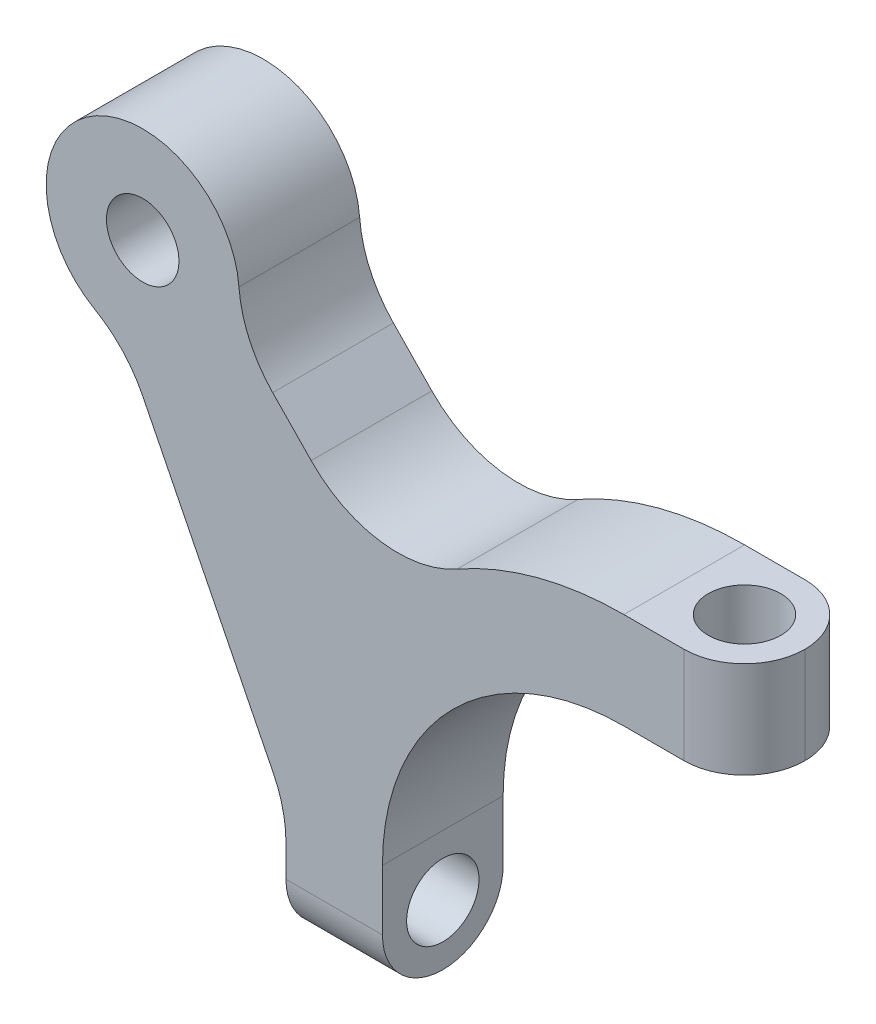
ISO-10303-21;
HEADER;
FILE_DESCRIPTION(('STEP AP214'),'2;1');
FILE_NAME('part.step','',(''),(''),'','','');
FILE_SCHEMA(('AUTOMOTIVE_DESIGN { 1 0 10303 214 1 1 1 1 }'));
ENDSEC;
DATA;
#1=APPLICATION_CONTEXT('core data for automotive mechanical design processes');
#2=APPLICATION_PROTOCOL_DEFINITION('international standard','automotive_design',2000,#1);
#3=PRODUCT_CONTEXT('',#1,'mechanical');
#4=PRODUCT('Part','Part','',(#3));
#5=PRODUCT_RELATED_PRODUCT_CATEGORY('part','',(#4));
#6=PRODUCT_DEFINITION_FORMATION('','',#4);
#7=PRODUCT_DEFINITION_CONTEXT('part definition',#1,'design');
#8=PRODUCT_DEFINITION('design','',#6,#7);
#9=PRODUCT_DEFINITION_SHAPE('','',#8);
#10=(LENGTH_UNIT() NAMED_UNIT(*) SI_UNIT(.MILLI.,.METRE.));
#11=(NAMED_UNIT(*) PLANE_ANGLE_UNIT() SI_UNIT($,.RADIAN.));
#12=(NAMED_UNIT(*) SI_UNIT($,.STERADIAN.) SOLID_ANGLE_UNIT());
#13=UNCERTAINTY_MEASURE_WITH_UNIT(LENGTH_MEASURE(1.E-05),#10,'distance_accuracy_value','');
#14=(GEOMETRIC_REPRESENTATION_CONTEXT(3) GLOBAL_UNCERTAINTY_ASSIGNED_CONTEXT((#13)) GLOBAL_UNIT_ASSIGNED_CONTEXT((#10,
#11,#12)) REPRESENTATION_CONTEXT('',''));
#15=CARTESIAN_POINT('',(0.,0.,0.));
#16=DIRECTION('',(0.,0.,1.));
#17=DIRECTION('',(1.,0.,0.));
#18=AXIS2_PLACEMENT_3D('',#15,#16,#17);
#19=CARTESIAN_POINT('',(-0.00318922240354763,0.,2.5));
#20=DIRECTION('',(0.,0.,-1.));
#21=DIRECTION('',(-1.,0.,0.));
#22=AXIS2_PLACEMENT_3D('',#19,#20,#21);
#23=CYLINDRICAL_SURFACE('',#22,9.99874453587523);
#24=CARTESIAN_POINT('',(-0.00318922240354763,0.,-2.5));
#25=DIRECTION('',(0.,0.,-1.));
#26=DIRECTION('',(-1.,0.,0.));
#27=AXIS2_PLACEMENT_3D('',#24,#25,#26);
#28=CIRCLE('',#27,9.99874453587523);
#29=CARTESIAN_POINT('',(-10.0019337582788,0.,-2.5));
#30=VERTEX_POINT('',#29);
#31=CARTESIAN_POINT('',(0.,9.99874402725438,-2.5));
#32=VERTEX_POINT('',#31);
#33=EDGE_CURVE('E205',#30,#32,#28,.T.);
#34=ORIENTED_EDGE('',*,*,#33,.T.);
#35=DIRECTION('',(0.,0.,-1.));
#36=VECTOR('',#35,1.);
#37=CARTESIAN_POINT('',(0.,9.99874402725438,2.5));
#38=LINE('',#37,#36);
#39=CARTESIAN_POINT('',(0.,9.99874402725438,2.5));
#40=VERTEX_POINT('',#39);
#41=EDGE_CURVE('E184',#40,#32,#38,.T.);
#42=ORIENTED_EDGE('',*,*,#41,.F.);
#43=CARTESIAN_POINT('',(-0.00318922240354763,0.,2.5));
#44=DIRECTION('',(0.,0.,-1.));
#45=DIRECTION('',(-1.,0.,0.));
#46=AXIS2_PLACEMENT_3D('',#43,#44,#45);
#47=CIRCLE('',#46,9.99874453587523);
#48=CARTESIAN_POINT('',(-10.0019337582788,0.,2.5));
#49=VERTEX_POINT('',#48);
#50=EDGE_CURVE('E191',#49,#40,#47,.T.);
#51=ORIENTED_EDGE('',*,*,#50,.F.);
#52=DIRECTION('',(0.,0.,-1.));
#53=VECTOR('',#52,1.);
#54=CARTESIAN_POINT('',(-10.0019337582788,0.,2.5));
#55=LINE('',#54,#53);
#56=EDGE_CURVE('E215',#49,#30,#55,.T.);
#57=ORIENTED_EDGE('',*,*,#56,.T.);
#58=EDGE_LOOP('',(#34,#42,#51,#57));
#59=FACE_BOUND('',#58,.T.);
#60=ADVANCED_FACE('F41',(#59),#23,.F.);
#61=CARTESIAN_POINT('',(0.,9.99874402725438,2.5));
#62=DIRECTION('',(0.,1.,0.));
#63=DIRECTION('',(0.,0.,1.));
#64=AXIS2_PLACEMENT_3D('',#61,#62,#63);
#65=PLANE('',#64);
#66=CARTESIAN_POINT('',(2.49606171015254,9.99874402725438,0.));
#67=DIRECTION('',(0.,1.,0.));
#68=DIRECTION('',(0.,0.,1.));
#69=AXIS2_PLACEMENT_3D('',#66,#67,#68);
#70=CIRCLE('',#69,1.50120281285982);
#71=CARTESIAN_POINT('',(2.49606171015254,9.99874402725438,1.50120281285982));
#72=VERTEX_POINT('',#71);
#73=EDGE_CURVE('E262',#72,#72,#70,.T.);
#74=ORIENTED_EDGE('',*,*,#73,.T.);
#75=EDGE_LOOP('',(#74));
#76=FACE_BOUND('',#75,.T.);
#77=DIRECTION('',(1.,0.,0.));
#78=VECTOR('',#77,1.);
#79=CARTESIAN_POINT('',(0.,9.99874402725438,-2.5));
#80=LINE('',#79,#78);
#81=CARTESIAN_POINT('',(2.49606171015254,9.99874402725438,-2.5));
#82=VERTEX_POINT('',#81);
#83=EDGE_CURVE('E435',#32,#82,#80,.T.);
#84=ORIENTED_EDGE('',*,*,#83,.T.);
#85=CARTESIAN_POINT('',(2.49606171015254,9.99874402725438,0.));
#86=DIRECTION('',(0.,1.,0.));
#87=DIRECTION('',(0.,0.,1.));
#88=AXIS2_PLACEMENT_3D('',#85,#86,#87);
#89=CIRCLE('',#88,2.5);
#90=CARTESIAN_POINT('',(4.99606171015254,9.99874402725438,0.));
#91=VERTEX_POINT('',#90);
#92=EDGE_CURVE('E250',#82,#91,#89,.F.);
#93=ORIENTED_EDGE('',*,*,#92,.T.);
#94=CARTESIAN_POINT('',(2.49606171015254,9.99874402725438,0.));
#95=DIRECTION('',(0.,1.,0.));
#96=DIRECTION('',(0.,0.,1.));
#97=AXIS2_PLACEMENT_3D('',#94,#95,#96);
#98=CIRCLE('',#97,2.5);
#99=CARTESIAN_POINT('',(2.49606171015254,9.99874402725438,2.5));
#100=VERTEX_POINT('',#99);
#101=EDGE_CURVE('E187',#91,#100,#98,.F.);
#102=ORIENTED_EDGE('',*,*,#101,.T.);
#103=DIRECTION('',(1.,0.,0.));
#104=VECTOR('',#103,1.);
#105=CARTESIAN_POINT('',(0.,9.99874402725438,2.5));
#106=LINE('',#105,#104);
#107=EDGE_CURVE('E179',#40,#100,#106,.T.);
#108=ORIENTED_EDGE('',*,*,#107,.F.);
#109=ORIENTED_EDGE('',*,*,#41,.T.);
#110=EDGE_LOOP('',(#84,#93,#102,#108,#109));
#111=FACE_BOUND('',#110,.T.);
#112=ADVANCED_FACE('F182',(#76,#111),#65,.F.);
#113=CARTESIAN_POINT('',(4.99606171015254,13.9979162963547,2.5));
#114=DIRECTION('',(0.,-1.,0.));
#115=DIRECTION('',(1.,0.,0.));
#116=AXIS2_PLACEMENT_3D('',#113,#114,#115);
#117=PLANE('',#116);
#118=CARTESIAN_POINT('',(2.49606171015254,13.9979162963547,0.));
#119=DIRECTION('',(0.,1.,0.));
#120=DIRECTION('',(-1.,0.,0.));
#121=AXIS2_PLACEMENT_3D('',#118,#119,#120);
#122=CIRCLE('',#121,1.50120281285982);
#123=CARTESIAN_POINT('',(0.994858897292727,13.9979162963547,0.));
#124=VERTEX_POINT('',#123);
#125=EDGE_CURVE('E267',#124,#124,#122,.T.);
#126=ORIENTED_EDGE('',*,*,#125,.F.);
#127=EDGE_LOOP('',(#126));
#128=FACE_BOUND('',#127,.T.);
#129=CARTESIAN_POINT('',(2.49606171015254,13.9979162963547,0.));
#130=DIRECTION('',(0.,-1.,0.));
#131=DIRECTION('',(1.,0.,0.));
#132=AXIS2_PLACEMENT_3D('',#129,#130,#131);
#133=CIRCLE('',#132,2.5);
#134=CARTESIAN_POINT('',(2.49606171015254,13.9979162963547,2.5));
#135=VERTEX_POINT('',#134);
#136=CARTESIAN_POINT('',(4.99606171015254,13.9979162963547,0.));
#137=VERTEX_POINT('',#136);
#138=EDGE_CURVE('E242',#135,#137,#133,.F.);
#139=ORIENTED_EDGE('',*,*,#138,.T.);
#140=CARTESIAN_POINT('',(2.49606171015254,13.9979162963547,0.));
#141=DIRECTION('',(0.,-1.,0.));
#142=DIRECTION('',(1.,0.,0.));
#143=AXIS2_PLACEMENT_3D('',#140,#141,#142);
#144=CIRCLE('',#143,2.5);
#145=CARTESIAN_POINT('',(2.49606171015254,13.9979162963547,-2.5));
#146=VERTEX_POINT('',#145);
#147=EDGE_CURVE('E245',#137,#146,#144,.F.);
#148=ORIENTED_EDGE('',*,*,#147,.T.);
#149=DIRECTION('',(-1.,0.,0.));
#150=VECTOR('',#149,1.);
#151=CARTESIAN_POINT('',(4.99606171015254,13.9979162963547,-2.5));
#152=LINE('',#151,#150);
#153=CARTESIAN_POINT('',(0.,13.9979162963547,-2.5));
#154=VERTEX_POINT('',#153);
#155=EDGE_CURVE('E438',#146,#154,#152,.T.);
#156=ORIENTED_EDGE('',*,*,#155,.T.);
#157=DIRECTION('',(0.,0.,-1.));
#158=VECTOR('',#157,1.);
#159=CARTESIAN_POINT('',(0.,13.9979162963547,2.5));
#160=LINE('',#159,#158);
#161=CARTESIAN_POINT('',(0.,13.9979162963547,2.5));
#162=VERTEX_POINT('',#161);
#163=EDGE_CURVE('E208',#162,#154,#160,.T.);
#164=ORIENTED_EDGE('',*,*,#163,.F.);
#165=DIRECTION('',(-1.,0.,0.));
#166=VECTOR('',#165,1.);
#167=CARTESIAN_POINT('',(4.99606171015254,13.9979162963547,2.5));
#168=LINE('',#167,#166);
#169=EDGE_CURVE('E190',#135,#162,#168,.T.);
#170=ORIENTED_EDGE('',*,*,#169,.F.);
#171=EDGE_LOOP('',(#139,#148,#156,#164,#170));
#172=FACE_BOUND('',#171,.T.);
#173=ADVANCED_FACE('F466',(#128,#172),#117,.F.);
#174=CARTESIAN_POINT('',(0.,0.,2.5));
#175=DIRECTION('',(0.,0.,-1.));
#176=DIRECTION('',(-1.,0.,0.));
#177=AXIS2_PLACEMENT_3D('',#174,#175,#176);
#178=CYLINDRICAL_SURFACE('',#177,13.9979162963547);
#179=CARTESIAN_POINT('',(0.,0.,-2.5));
#180=DIRECTION('',(0.,0.,1.));
#181=DIRECTION('',(1.,0.,0.));
#182=AXIS2_PLACEMENT_3D('',#179,#180,#181);
#183=CIRCLE('',#182,13.9979162963547);
#184=CARTESIAN_POINT('',(-6.90227658031211,12.1778585411651,-2.5));
#185=VERTEX_POINT('',#184);
#186=EDGE_CURVE('E441',#154,#185,#183,.T.);
#187=ORIENTED_EDGE('',*,*,#186,.T.);
#188=DIRECTION('',(0.,0.,-1.));
#189=VECTOR('',#188,1.);
#190=CARTESIAN_POINT('',(-6.90227658031211,12.1778585411651,2.5));
#191=LINE('',#190,#189);
#192=CARTESIAN_POINT('',(-6.90227658031211,12.1778585411651,2.5));
#193=VERTEX_POINT('',#192);
#194=EDGE_CURVE('E350',#185,#193,#191,.F.);
#195=ORIENTED_EDGE('',*,*,#194,.T.);
#196=CARTESIAN_POINT('',(0.,0.,2.5));
#197=DIRECTION('',(0.,0.,1.));
#198=DIRECTION('',(1.,0.,0.));
#199=AXIS2_PLACEMENT_3D('',#196,#197,#198);
#200=CIRCLE('',#199,13.9979162963547);
#201=EDGE_CURVE('E424',#162,#193,#200,.T.);
#202=ORIENTED_EDGE('',*,*,#201,.F.);
#203=ORIENTED_EDGE('',*,*,#163,.T.);
#204=EDGE_LOOP('',(#187,#195,#202,#203));
#205=FACE_BOUND('',#204,.T.);
#206=ADVANCED_FACE('F472',(#205),#178,.T.);
#207=CARTESIAN_POINT('',(-13.9979162963547,-4.9970482215029,2.5));
#208=DIRECTION('',(1.,0.,0.));
#209=DIRECTION('',(0.,0.,-1.));
#210=AXIS2_PLACEMENT_3D('',#207,#208,#209);
#211=PLANE('',#210);
#212=DIRECTION('',(0.,-1.,0.));
#213=VECTOR('',#212,1.);
#214=CARTESIAN_POINT('',(-13.9979162963547,-4.9970482215029,2.5));
#215=LINE('',#214,#213);
#216=CARTESIAN_POINT('',(-13.9979162963547,-1.18028034895167,2.5));
#217=VERTEX_POINT('',#216);
#218=CARTESIAN_POINT('',(-13.9979162963547,-2.4970482215029,2.5));
#219=VERTEX_POINT('',#218);
#220=EDGE_CURVE('E428',#217,#219,#215,.T.);
#221=ORIENTED_EDGE('',*,*,#220,.F.);
#222=DIRECTION('',(0.,0.,-1.));
#223=VECTOR('',#222,1.);
#224=CARTESIAN_POINT('',(-13.9979162963547,-1.18028034895167,2.5));
#225=LINE('',#224,#223);
#226=CARTESIAN_POINT('',(-13.9979162963547,-1.18028034895167,0.718041075192991));
#227=VERTEX_POINT('',#226);
#228=EDGE_CURVE('E344',#217,#227,#225,.T.);
#229=ORIENTED_EDGE('',*,*,#228,.T.);
#230=CARTESIAN_POINT('',(-13.9979162963547,-2.4970482215029,0.));
#231=DIRECTION('',(-1.,0.,0.));
#232=DIRECTION('',(0.,0.,1.));
#233=AXIS2_PLACEMENT_3D('',#230,#231,#232);
#234=CIRCLE('',#233,1.4998201945058);
#235=CARTESIAN_POINT('',(-13.9979162963547,-1.18028034895167,-0.718041075192991));
#236=VERTEX_POINT('',#235);
#237=EDGE_CURVE('E407',#236,#227,#234,.T.);
#238=ORIENTED_EDGE('',*,*,#237,.F.);
#239=DIRECTION('',(0.,0.,-1.));
#240=VECTOR('',#239,1.);
#241=CARTESIAN_POINT('',(-13.9979162963547,-1.18028034895167,2.5));
#242=LINE('',#241,#240);
#243=CARTESIAN_POINT('',(-13.9979162963547,-1.18028034895167,-2.5));
#244=VERTEX_POINT('',#243);
#245=EDGE_CURVE('E70',#236,#244,#242,.T.);
#246=ORIENTED_EDGE('',*,*,#245,.T.);
#247=DIRECTION('',(0.,-1.,0.));
#248=VECTOR('',#247,1.);
#249=CARTESIAN_POINT('',(-13.9979162963547,-4.9970482215029,-2.5));
#250=LINE('',#249,#248);
#251=CARTESIAN_POINT('',(-13.9979162963547,-2.4970482215029,-2.5));
#252=VERTEX_POINT('',#251);
#253=EDGE_CURVE('E445',#244,#252,#250,.T.);
#254=ORIENTED_EDGE('',*,*,#253,.T.);
#255=CARTESIAN_POINT('',(-13.9979162963547,-2.4970482215029,0.));
#256=DIRECTION('',(1.,0.,0.));
#257=DIRECTION('',(0.,0.,-1.));
#258=AXIS2_PLACEMENT_3D('',#255,#256,#257);
#259=CIRCLE('',#258,2.5);
#260=CARTESIAN_POINT('',(-13.9979162963547,-4.9970482215029,0.));
#261=VERTEX_POINT('',#260);
#262=EDGE_CURVE('E233',#252,#261,#259,.F.);
#263=ORIENTED_EDGE('',*,*,#262,.T.);
#264=CARTESIAN_POINT('',(-13.9979162963547,-2.4970482215029,0.));
#265=DIRECTION('',(1.,0.,0.));
#266=DIRECTION('',(0.,0.,-1.));
#267=AXIS2_PLACEMENT_3D('',#264,#265,#266);
#268=CIRCLE('',#267,2.5);
#269=EDGE_CURVE('E229',#261,#219,#268,.F.);
#270=ORIENTED_EDGE('',*,*,#269,.T.);
#271=EDGE_LOOP('',(#221,#229,#238,#246,#254,#263,#270));
#272=FACE_BOUND('',#271,.T.);
#273=ADVANCED_FACE('F310',(#272),#211,.F.);
#274=CARTESIAN_POINT('',(-10.0019337582788,0.,2.5));
#275=DIRECTION('',(-1.,0.,0.));
#276=DIRECTION('',(0.,0.,1.));
#277=AXIS2_PLACEMENT_3D('',#274,#275,#276);
#278=PLANE('',#277);
#279=CARTESIAN_POINT('',(-10.0019337582788,-2.4970482215029,0.));
#280=DIRECTION('',(-1.,0.,0.));
#281=DIRECTION('',(0.,0.,1.));
#282=AXIS2_PLACEMENT_3D('',#279,#280,#281);
#283=CIRCLE('',#282,1.4998201945058);
#284=CARTESIAN_POINT('',(-10.0019337582788,-2.4970482215029,1.4998201945058));
#285=VERTEX_POINT('',#284);
#286=EDGE_CURVE('E263',#285,#285,#283,.T.);
#287=ORIENTED_EDGE('',*,*,#286,.T.);
#288=EDGE_LOOP('',(#287));
#289=FACE_BOUND('',#288,.T.);
#290=CARTESIAN_POINT('',(-10.0019337582788,-2.4970482215029,0.));
#291=DIRECTION('',(-1.,0.,0.));
#292=DIRECTION('',(0.,0.,1.));
#293=AXIS2_PLACEMENT_3D('',#290,#291,#292);
#294=CIRCLE('',#293,2.5);
#295=CARTESIAN_POINT('',(-10.0019337582788,-2.4970482215029,2.5));
#296=VERTEX_POINT('',#295);
#297=CARTESIAN_POINT('',(-10.0019337582788,-4.9970482215029,0.));
#298=VERTEX_POINT('',#297);
#299=EDGE_CURVE('E207',#296,#298,#294,.F.);
#300=ORIENTED_EDGE('',*,*,#299,.T.);
#301=CARTESIAN_POINT('',(-10.0019337582788,-2.4970482215029,0.));
#302=DIRECTION('',(-1.,0.,0.));
#303=DIRECTION('',(0.,0.,1.));
#304=AXIS2_PLACEMENT_3D('',#301,#302,#303);
#305=CIRCLE('',#304,2.5);
#306=CARTESIAN_POINT('',(-10.0019337582788,-2.4970482215029,-2.5));
#307=VERTEX_POINT('',#306);
#308=EDGE_CURVE('E212',#298,#307,#305,.F.);
#309=ORIENTED_EDGE('',*,*,#308,.T.);
#310=DIRECTION('',(0.,1.,0.));
#311=VECTOR('',#310,1.);
#312=CARTESIAN_POINT('',(-10.0019337582788,0.,-2.5));
#313=LINE('',#312,#311);
#314=EDGE_CURVE('E202',#307,#30,#313,.T.);
#315=ORIENTED_EDGE('',*,*,#314,.T.);
#316=ORIENTED_EDGE('',*,*,#56,.F.);
#317=DIRECTION('',(0.,1.,0.));
#318=VECTOR('',#317,1.);
#319=CARTESIAN_POINT('',(-10.0019337582788,0.,2.5));
#320=LINE('',#319,#318);
#321=EDGE_CURVE('E197',#296,#49,#320,.T.);
#322=ORIENTED_EDGE('',*,*,#321,.F.);
#323=EDGE_LOOP('',(#300,#309,#315,#316,#322));
#324=FACE_BOUND('',#323,.T.);
#325=ADVANCED_FACE('F503',(#289,#324),#278,.F.);
#326=CARTESIAN_POINT('',(-0.00318922240354763,0.,2.5));
#327=DIRECTION('',(0.,0.,-1.));
#328=DIRECTION('',(-1.,0.,0.));
#329=AXIS2_PLACEMENT_3D('',#326,#327,#328);
#330=PLANE('',#329);
#331=DIRECTION('',(-0.447193418585765,0.89443727917254,0.));
#332=VECTOR('',#331,1.);
#333=CARTESIAN_POINT('',(-13.9979162963547,0.,2.5));
#334=LINE('',#333,#332);
#335=CARTESIAN_POINT('',(-14.525729900492,1.05568674397716,2.5));
#336=VERTEX_POINT('',#335);
#337=CARTESIAN_POINT('',(-19.9441669511495,11.8931720278271,2.5));
#338=VERTEX_POINT('',#337);
#339=EDGE_CURVE('E386',#336,#338,#334,.T.);
#340=ORIENTED_EDGE('',*,*,#339,.F.);
#341=CARTESIAN_POINT('',(-18.9979162963547,-1.18028034895167,2.5));
#342=DIRECTION('',(0.,0.,-1.));
#343=DIRECTION('',(-1.,0.,0.));
#344=AXIS2_PLACEMENT_3D('',#341,#342,#343);
#345=CIRCLE('',#344,5.);
#346=EDGE_CURVE('E11',#336,#217,#345,.T.);
#347=ORIENTED_EDGE('',*,*,#346,.T.);
#348=ORIENTED_EDGE('',*,*,#220,.T.);
#349=DIRECTION('',(1.,0.,0.));
#350=VECTOR('',#349,1.);
#351=CARTESIAN_POINT('',(-0.00318922240354763,-2.4970482215029,2.5));
#352=LINE('',#351,#350);
#353=EDGE_CURVE('E239',#219,#296,#352,.T.);
#354=ORIENTED_EDGE('',*,*,#353,.T.);
#355=ORIENTED_EDGE('',*,*,#321,.T.);
#356=ORIENTED_EDGE('',*,*,#50,.T.);
#357=ORIENTED_EDGE('',*,*,#107,.T.);
#358=DIRECTION('',(0.,1.,0.));
#359=VECTOR('',#358,1.);
#360=CARTESIAN_POINT('',(2.49606171015254,0.,2.5));
#361=LINE('',#360,#359);
#362=EDGE_CURVE('E236',#100,#135,#361,.T.);
#363=ORIENTED_EDGE('',*,*,#362,.T.);
#364=ORIENTED_EDGE('',*,*,#169,.T.);
#365=ORIENTED_EDGE('',*,*,#201,.T.);
#366=CARTESIAN_POINT('',(-9.36774230898973,16.5277411534566,2.5));
#367=DIRECTION('',(0.,0.,-1.));
#368=DIRECTION('',(-1.,0.,0.));
#369=AXIS2_PLACEMENT_3D('',#366,#367,#368);
#370=CIRCLE('',#369,5.);
#371=CARTESIAN_POINT('',(-12.9544812886517,13.0441649031396,2.5));
#372=VERTEX_POINT('',#371);
#373=EDGE_CURVE('E326',#193,#372,#370,.T.);
#374=ORIENTED_EDGE('',*,*,#373,.T.);
#375=DIRECTION('',(0.696715250063416,-0.7173477959324,0.));
#376=VECTOR('',#375,1.);
#377=CARTESIAN_POINT('',(-9.89843070577183,9.89761234858118,2.5));
#378=LINE('',#377,#376);
#379=CARTESIAN_POINT('',(-14.5481187301345,14.6849963705992,2.5));
#380=VERTEX_POINT('',#379);
#381=EDGE_CURVE('E396',#380,#372,#378,.T.);
#382=ORIENTED_EDGE('',*,*,#381,.F.);
#383=CARTESIAN_POINT('',(-10.9613797504725,18.1685726209162,2.5));
#384=DIRECTION('',(0.,0.,-1.));
#385=DIRECTION('',(-1.,0.,0.));
#386=AXIS2_PLACEMENT_3D('',#383,#384,#385);
#387=CIRCLE('',#386,5.);
#388=CARTESIAN_POINT('',(-15.9458473271227,17.7747668600103,2.5));
#389=VERTEX_POINT('',#388);
#390=EDGE_CURVE('E332',#380,#389,#387,.T.);
#391=ORIENTED_EDGE('',*,*,#390,.T.);
#392=CARTESIAN_POINT('',(-19.9325703990469,17.4597894850515,2.5));
#393=DIRECTION('',(0.,0.,-1.));
#394=DIRECTION('',(1.,0.,0.));
#395=AXIS2_PLACEMENT_3D('',#392,#393,#394);
#396=CIRCLE('',#395,3.99914635878064);
#397=CARTESIAN_POINT('',(-21.9251265299317,13.9923853170576,2.5));
#398=VERTEX_POINT('',#397);
#399=EDGE_CURVE('E390',#398,#389,#396,.T.);
#400=ORIENTED_EDGE('',*,*,#399,.F.);
#401=CARTESIAN_POINT('',(-24.4163533470122,9.65720493489829,2.5));
#402=DIRECTION('',(0.,0.,-1.));
#403=DIRECTION('',(-1.,0.,0.));
#404=AXIS2_PLACEMENT_3D('',#401,#402,#403);
#405=CIRCLE('',#404,5.);
#406=EDGE_CURVE('E338',#398,#338,#405,.T.);
#407=ORIENTED_EDGE('',*,*,#406,.T.);
#408=EDGE_LOOP('',(#340,#347,#348,#354,#355,#356,#357,#363,#364,#365,#374,#382,#391,#400,#407));
#409=FACE_BOUND('',#408,.T.);
#410=CARTESIAN_POINT('',(-19.9325703990469,17.4597894850515,2.5));
#411=DIRECTION('',(0.,0.,-1.));
#412=DIRECTION('',(-1.,0.,0.));
#413=AXIS2_PLACEMENT_3D('',#410,#411,#412);
#414=CIRCLE('',#413,1.50076270632047);
#415=CARTESIAN_POINT('',(-21.4333331053674,17.4597894850515,2.5));
#416=VERTEX_POINT('',#415);
#417=EDGE_CURVE('E410',#416,#416,#414,.T.);
#418=ORIENTED_EDGE('',*,*,#417,.T.);
#419=EDGE_LOOP('',(#418));
#420=FACE_BOUND('',#419,.T.);
#421=ADVANCED_FACE('F194',(#409,#420),#330,.F.);
#422=CARTESIAN_POINT('',(-0.00318922240354763,0.,-2.5));
#423=DIRECTION('',(0.,0.,-1.));
#424=DIRECTION('',(-1.,0.,0.));
#425=AXIS2_PLACEMENT_3D('',#422,#423,#424);
#426=PLANE('',#425);
#427=ORIENTED_EDGE('',*,*,#314,.F.);
#428=DIRECTION('',(1.,0.,0.));
#429=VECTOR('',#428,1.);
#430=CARTESIAN_POINT('',(-13.9979162963547,-2.4970482215029,-2.5));
#431=LINE('',#430,#429);
#432=EDGE_CURVE('E225',#307,#252,#431,.F.);
#433=ORIENTED_EDGE('',*,*,#432,.T.);
#434=ORIENTED_EDGE('',*,*,#253,.F.);
#435=CARTESIAN_POINT('',(-18.9979162963547,-1.18028034895167,-2.5));
#436=DIRECTION('',(0.,0.,-1.));
#437=DIRECTION('',(-1.,0.,0.));
#438=AXIS2_PLACEMENT_3D('',#435,#436,#437);
#439=CIRCLE('',#438,5.);
#440=CARTESIAN_POINT('',(-14.525729900492,1.05568674397716,-2.5));
#441=VERTEX_POINT('',#440);
#442=EDGE_CURVE('E56',#244,#441,#439,.F.);
#443=ORIENTED_EDGE('',*,*,#442,.T.);
#444=DIRECTION('',(-0.447193418585765,0.89443727917254,0.));
#445=VECTOR('',#444,1.);
#446=CARTESIAN_POINT('',(-13.9979162963547,0.,-2.5));
#447=LINE('',#446,#445);
#448=CARTESIAN_POINT('',(-19.9441669511495,11.8931720278271,-2.5));
#449=VERTEX_POINT('',#448);
#450=EDGE_CURVE('E378',#441,#449,#447,.T.);
#451=ORIENTED_EDGE('',*,*,#450,.T.);
#452=CARTESIAN_POINT('',(-24.4163533470122,9.65720493489829,-2.5));
#453=DIRECTION('',(0.,0.,-1.));
#454=DIRECTION('',(-1.,0.,0.));
#455=AXIS2_PLACEMENT_3D('',#452,#453,#454);
#456=CIRCLE('',#455,5.);
#457=CARTESIAN_POINT('',(-21.9251265299317,13.9923853170576,-2.5));
#458=VERTEX_POINT('',#457);
#459=EDGE_CURVE('E341',#449,#458,#456,.F.);
#460=ORIENTED_EDGE('',*,*,#459,.T.);
#461=CARTESIAN_POINT('',(-19.9325703990469,17.4597894850515,-2.5));
#462=DIRECTION('',(0.,0.,-1.));
#463=DIRECTION('',(1.,0.,0.));
#464=AXIS2_PLACEMENT_3D('',#461,#462,#463);
#465=CIRCLE('',#464,3.99914635878064);
#466=CARTESIAN_POINT('',(-15.9458473271227,17.7747668600103,-2.5));
#467=VERTEX_POINT('',#466);
#468=EDGE_CURVE('E399',#458,#467,#465,.T.);
#469=ORIENTED_EDGE('',*,*,#468,.T.);
#470=CARTESIAN_POINT('',(-10.9613797504725,18.1685726209162,-2.5));
#471=DIRECTION('',(0.,0.,-1.));
#472=DIRECTION('',(-1.,0.,0.));
#473=AXIS2_PLACEMENT_3D('',#470,#471,#472);
#474=CIRCLE('',#473,5.);
#475=CARTESIAN_POINT('',(-14.5481187301345,14.6849963705992,-2.5));
#476=VERTEX_POINT('',#475);
#477=EDGE_CURVE('E335',#467,#476,#474,.F.);
#478=ORIENTED_EDGE('',*,*,#477,.T.);
#479=DIRECTION('',(0.696715250063416,-0.7173477959324,0.));
#480=VECTOR('',#479,1.);
#481=CARTESIAN_POINT('',(-9.89843070577183,9.89761234858118,-2.5));
#482=LINE('',#481,#480);
#483=CARTESIAN_POINT('',(-12.9544812886517,13.0441649031396,-2.5));
#484=VERTEX_POINT('',#483);
#485=EDGE_CURVE('E391',#476,#484,#482,.T.);
#486=ORIENTED_EDGE('',*,*,#485,.T.);
#487=CARTESIAN_POINT('',(-9.36774230898973,16.5277411534566,-2.5));
#488=DIRECTION('',(0.,0.,-1.));
#489=DIRECTION('',(-1.,0.,0.));
#490=AXIS2_PLACEMENT_3D('',#487,#488,#489);
#491=CIRCLE('',#490,5.);
#492=EDGE_CURVE('E329',#484,#185,#491,.F.);
#493=ORIENTED_EDGE('',*,*,#492,.T.);
#494=ORIENTED_EDGE('',*,*,#186,.F.);
#495=ORIENTED_EDGE('',*,*,#155,.F.);
#496=DIRECTION('',(0.,1.,0.));
#497=VECTOR('',#496,1.);
#498=CARTESIAN_POINT('',(2.49606171015254,9.99874402725438,-2.5));
#499=LINE('',#498,#497);
#500=EDGE_CURVE('E221',#146,#82,#499,.F.);
#501=ORIENTED_EDGE('',*,*,#500,.T.);
#502=ORIENTED_EDGE('',*,*,#83,.F.);
#503=ORIENTED_EDGE('',*,*,#33,.F.);
#504=EDGE_LOOP('',(#427,#433,#434,#443,#451,#460,#469,#478,#486,#493,#494,#495,#501,#502,#503));
#505=FACE_BOUND('',#504,.T.);
#506=CARTESIAN_POINT('',(-19.9325703990469,17.4597894850515,-2.5));
#507=DIRECTION('',(0.,0.,-1.));
#508=DIRECTION('',(-1.,0.,0.));
#509=AXIS2_PLACEMENT_3D('',#506,#507,#508);
#510=CIRCLE('',#509,1.50076270632047);
#511=CARTESIAN_POINT('',(-21.4333331053674,17.4597894850515,-2.5));
#512=VERTEX_POINT('',#511);
#513=EDGE_CURVE('E320',#512,#512,#510,.T.);
#514=ORIENTED_EDGE('',*,*,#513,.F.);
#515=EDGE_LOOP('',(#514));
#516=FACE_BOUND('',#515,.T.);
#517=ADVANCED_FACE('F453',(#505,#516),#426,.T.);
#518=CARTESIAN_POINT('',(-0.00318922240354763,-2.4970482215029,0.));
#519=DIRECTION('',(1.,0.,0.));
#520=DIRECTION('',(0.,0.,-1.));
#521=AXIS2_PLACEMENT_3D('',#518,#519,#520);
#522=CYLINDRICAL_SURFACE('',#521,2.5);
#523=ORIENTED_EDGE('',*,*,#353,.F.);
#524=ORIENTED_EDGE('',*,*,#269,.F.);
#525=DIRECTION('',(1.,0.,0.));
#526=VECTOR('',#525,1.);
#527=CARTESIAN_POINT('',(-10.0019337582788,-4.9970482215029,0.));
#528=LINE('',#527,#526);
#529=EDGE_CURVE('E254',#298,#261,#528,.F.);
#530=ORIENTED_EDGE('',*,*,#529,.F.);
#531=ORIENTED_EDGE('',*,*,#299,.F.);
#532=EDGE_LOOP('',(#523,#524,#530,#531));
#533=FACE_BOUND('',#532,.T.);
#534=ADVANCED_FACE('F501',(#533),#522,.T.);
#535=CARTESIAN_POINT('',(-10.0019337582788,-2.4970482215029,0.));
#536=DIRECTION('',(-1.,0.,0.));
#537=DIRECTION('',(0.,0.,1.));
#538=AXIS2_PLACEMENT_3D('',#535,#536,#537);
#539=CYLINDRICAL_SURFACE('',#538,2.5);
#540=ORIENTED_EDGE('',*,*,#262,.F.);
#541=ORIENTED_EDGE('',*,*,#432,.F.);
#542=ORIENTED_EDGE('',*,*,#308,.F.);
#543=ORIENTED_EDGE('',*,*,#529,.T.);
#544=EDGE_LOOP('',(#540,#541,#542,#543));
#545=FACE_BOUND('',#544,.T.);
#546=ADVANCED_FACE('F495',(#545),#539,.T.);
#547=CARTESIAN_POINT('',(2.49606171015254,0.,0.));
#548=DIRECTION('',(0.,1.,0.));
#549=DIRECTION('',(0.,0.,1.));
#550=AXIS2_PLACEMENT_3D('',#547,#548,#549);
#551=CYLINDRICAL_SURFACE('',#550,2.5);
#552=ORIENTED_EDGE('',*,*,#362,.F.);
#553=ORIENTED_EDGE('',*,*,#101,.F.);
#554=DIRECTION('',(0.,1.,0.));
#555=VECTOR('',#554,1.);
#556=CARTESIAN_POINT('',(4.99606171015254,9.99874402725438,0.));
#557=LINE('',#556,#555);
#558=EDGE_CURVE('E258',#137,#91,#557,.F.);
#559=ORIENTED_EDGE('',*,*,#558,.F.);
#560=ORIENTED_EDGE('',*,*,#138,.F.);
#561=EDGE_LOOP('',(#552,#553,#559,#560));
#562=FACE_BOUND('',#561,.T.);
#563=ADVANCED_FACE('F461',(#562),#551,.T.);
#564=CARTESIAN_POINT('',(2.49606171015254,9.99874402725438,0.));
#565=DIRECTION('',(0.,-1.,0.));
#566=DIRECTION('',(0.,0.,-1.));
#567=AXIS2_PLACEMENT_3D('',#564,#565,#566);
#568=CYLINDRICAL_SURFACE('',#567,2.5);
#569=ORIENTED_EDGE('',*,*,#92,.F.);
#570=ORIENTED_EDGE('',*,*,#500,.F.);
#571=ORIENTED_EDGE('',*,*,#147,.F.);
#572=ORIENTED_EDGE('',*,*,#558,.T.);
#573=EDGE_LOOP('',(#569,#570,#571,#572));
#574=FACE_BOUND('',#573,.T.);
#575=ADVANCED_FACE('F464',(#574),#568,.T.);
#576=CARTESIAN_POINT('',(2.49606171015254,8.99791629635473,0.));
#577=DIRECTION('',(0.,1.,0.));
#578=DIRECTION('',(-1.,0.,0.));
#579=AXIS2_PLACEMENT_3D('',#576,#577,#578);
#580=CYLINDRICAL_SURFACE('',#579,1.50120281285982);
#581=ORIENTED_EDGE('',*,*,#125,.T.);
#582=EDGE_LOOP('',(#581));
#583=FACE_BOUND('',#582,.T.);
#584=ORIENTED_EDGE('',*,*,#73,.F.);
#585=EDGE_LOOP('',(#584));
#586=FACE_BOUND('',#585,.T.);
#587=ADVANCED_FACE('F526',(#583,#586),#580,.F.);
#588=CARTESIAN_POINT('',(-8.99791629635473,-2.4970482215029,0.));
#589=DIRECTION('',(-1.,0.,0.));
#590=DIRECTION('',(0.,0.,1.));
#591=AXIS2_PLACEMENT_3D('',#588,#589,#590);
#592=CYLINDRICAL_SURFACE('',#591,1.4998201945058);
#593=EDGE_CURVE('E268',#227,#236,#234,.T.);
#594=ORIENTED_EDGE('',*,*,#593,.T.);
#595=ORIENTED_EDGE('',*,*,#237,.T.);
#596=EDGE_LOOP('',(#594,#595));
#597=FACE_BOUND('',#596,.T.);
#598=ORIENTED_EDGE('',*,*,#286,.F.);
#599=EDGE_LOOP('',(#598));
#600=FACE_BOUND('',#599,.T.);
#601=ADVANCED_FACE('F295',(#597,#600),#592,.F.);
#602=CARTESIAN_POINT('',(-9.89843070577183,9.89761234858118,2.5));
#603=DIRECTION('',(0.7173477959324,0.696715250063416,0.));
#604=DIRECTION('',(-0.696715250063416,0.7173477959324,0.));
#605=AXIS2_PLACEMENT_3D('',#602,#603,#604);
#606=PLANE('',#605);
#607=ORIENTED_EDGE('',*,*,#485,.F.);
#608=DIRECTION('',(0.,0.,1.));
#609=VECTOR('',#608,1.);
#610=CARTESIAN_POINT('',(-14.5481187301345,14.6849963705992,2.5));
#611=LINE('',#610,#609);
#612=EDGE_CURVE('E353',#476,#380,#611,.T.);
#613=ORIENTED_EDGE('',*,*,#612,.T.);
#614=ORIENTED_EDGE('',*,*,#381,.T.);
#615=DIRECTION('',(0.,0.,-1.));
#616=VECTOR('',#615,1.);
#617=CARTESIAN_POINT('',(-12.9544812886517,13.0441649031396,2.5));
#618=LINE('',#617,#616);
#619=EDGE_CURVE('E356',#372,#484,#618,.T.);
#620=ORIENTED_EDGE('',*,*,#619,.T.);
#621=EDGE_LOOP('',(#607,#613,#614,#620));
#622=FACE_BOUND('',#621,.T.);
#623=ADVANCED_FACE('F482',(#622),#606,.T.);
#624=CARTESIAN_POINT('',(-19.9325703990469,17.4597894850515,2.5));
#625=DIRECTION('',(0.,0.,-1.));
#626=DIRECTION('',(-1.,0.,0.));
#627=AXIS2_PLACEMENT_3D('',#624,#625,#626);
#628=CYLINDRICAL_SURFACE('',#627,3.99914635878064);
#629=ORIENTED_EDGE('',*,*,#468,.F.);
#630=DIRECTION('',(0.,0.,-1.));
#631=VECTOR('',#630,1.);
#632=CARTESIAN_POINT('',(-21.9251265299317,13.9923853170576,2.5));
#633=LINE('',#632,#631);
#634=EDGE_CURVE('E360',#458,#398,#633,.F.);
#635=ORIENTED_EDGE('',*,*,#634,.T.);
#636=ORIENTED_EDGE('',*,*,#399,.T.);
#637=DIRECTION('',(0.,0.,-1.));
#638=VECTOR('',#637,1.);
#639=CARTESIAN_POINT('',(-15.9458473271227,17.7747668600103,2.5));
#640=LINE('',#639,#638);
#641=EDGE_CURVE('E363',#389,#467,#640,.T.);
#642=ORIENTED_EDGE('',*,*,#641,.T.);
#643=EDGE_LOOP('',(#629,#635,#636,#642));
#644=FACE_BOUND('',#643,.T.);
#645=ADVANCED_FACE('F292',(#644),#628,.T.);
#646=CARTESIAN_POINT('',(-13.9979162963547,0.,2.5));
#647=DIRECTION('',(-0.89443727917254,-0.447193418585765,0.));
#648=DIRECTION('',(0.447193418585765,-0.89443727917254,0.));
#649=AXIS2_PLACEMENT_3D('',#646,#647,#648);
#650=PLANE('',#649);
#651=ORIENTED_EDGE('',*,*,#339,.T.);
#652=DIRECTION('',(0.,0.,1.));
#653=VECTOR('',#652,1.);
#654=CARTESIAN_POINT('',(-19.9441669511495,11.8931720278271,-2.5));
#655=LINE('',#654,#653);
#656=EDGE_CURVE('E366',#338,#449,#655,.F.);
#657=ORIENTED_EDGE('',*,*,#656,.T.);
#658=ORIENTED_EDGE('',*,*,#450,.F.);
#659=DIRECTION('',(0.,0.,-1.));
#660=VECTOR('',#659,1.);
#661=CARTESIAN_POINT('',(-14.525729900492,1.05568674397716,2.5));
#662=LINE('',#661,#660);
#663=CARTESIAN_POINT('',(-14.525729900492,1.05568674397716,-0.718041075192991));
#664=VERTEX_POINT('',#663);
#665=EDGE_CURVE('E280',#441,#664,#662,.F.);
#666=ORIENTED_EDGE('',*,*,#665,.T.);
#667=CARTESIAN_POINT('',(-13.9979162963547,-1.58168343679251,1.18809424153116));
#668=CARTESIAN_POINT('',(-13.8870048754792,-0.221835352208052,1.39157124552471));
#669=CARTESIAN_POINT('',(-14.494714224246,0.993651893015058,1.6285757849415));
#670=CARTESIAN_POINT('',(-13.9979162963547,-1.54986365894725,1.16345290790393));
#671=CARTESIAN_POINT('',(-13.897491823558,-0.200860273155811,1.34397530801014));
#672=CARTESIAN_POINT('',(-14.5005933749604,1.00541085759344,1.55336752740347));
#673=CARTESIAN_POINT('',(-13.9979162963547,-1.51717871325724,1.13633919979631));
#674=CARTESIAN_POINT('',(-13.9077345522041,-0.180373660516377,1.29472875757329));
#675=CARTESIAN_POINT('',(-14.5055164700188,1.01525760301971,1.47780971442109));
#676=CARTESIAN_POINT('',(-13.9979162963547,-1.45064981194229,1.07546562879938));
#677=CARTESIAN_POINT('',(-13.9276383073711,-0.140563905101806,1.19226653844073));
#678=CARTESIAN_POINT('',(-14.5136267170011,1.03147901179456,1.32631250294696));
#679=CARTESIAN_POINT('',(-13.9979162963547,-1.4168072062496,1.04171330261043));
#680=CARTESIAN_POINT('',(-13.9373003344166,-0.121238761164669,1.13906462745803));
#681=CARTESIAN_POINT('',(-14.5168158221778,1.03785758186881,1.25037363146166));
#682=CARTESIAN_POINT('',(-13.9979162963547,-1.348529607886,0.965890509556039));
#683=CARTESIAN_POINT('',(-13.9559727992038,-0.0838917253954033,1.02797906789187));
#684=CARTESIAN_POINT('',(-14.5216417972715,1.04751007641101,1.09841576530907));
#685=CARTESIAN_POINT('',(-13.9979162963547,-1.31409596086282,0.923837109771333));
#686=CARTESIAN_POINT('',(-13.9649852600108,-0.0658657872044523,0.97011462891789));
#687=CARTESIAN_POINT('',(-14.5232818127603,1.05079029237708,1.02239724816727));
#688=CARTESIAN_POINT('',(-13.9979162963547,-1.24596329244311,0.829247436458323));
#689=CARTESIAN_POINT('',(-13.9821782178479,-0.0314779322189693,0.84861938366805));
#690=CARTESIAN_POINT('',(-14.5253256915965,1.05487828059251,0.870264723488791));
#691=CARTESIAN_POINT('',(-13.9979162963547,-1.21226448564774,0.776708144953703));
#692=CARTESIAN_POINT('',(-13.9903601628821,-0.0151131192531748,0.784993786693786));
#693=CARTESIAN_POINT('',(-14.5257291985125,1.05568533993898,0.794150694744312));
#694=CARTESIAN_POINT('',(-13.9979162963547,-1.15402937820618,0.669890094986734));
#695=CARTESIAN_POINT('',(-14.0041094706195,0.0123870470999292,0.663165071229503));
#696=CARTESIAN_POINT('',(-14.5257304766431,1.0556878963442,0.655573958997481));
#697=CARTESIAN_POINT('',(-13.9979162963547,-1.12893345435421,0.617611213511645));
#698=CARTESIAN_POINT('',(-14.009883019136,0.0239347953708751,0.60604711006716));
#699=CARTESIAN_POINT('',(-14.5254597098101,1.05514633213672,0.593109812983116));
#700=CARTESIAN_POINT('',(-13.9979162963547,-1.08334345993866,0.504584212857937));
#701=CARTESIAN_POINT('',(-14.0201974548823,0.0445648302991583,0.487352814167998));
#702=CARTESIAN_POINT('',(-14.5246756059907,1.05357803605347,0.468198768000114));
#703=CARTESIAN_POINT('',(-13.9979162963547,-1.06284879656816,0.443837186315753));
#704=CARTESIAN_POINT('',(-14.0247409432915,0.0536523196087415,0.425768917510256));
#705=CARTESIAN_POINT('',(-14.5241623002784,1.05255136672956,0.405751867846176));
#706=CARTESIAN_POINT('',(-13.9979162963547,-1.02919337572828,0.315058987643325));
#707=CARTESIAN_POINT('',(-14.0321299032215,0.0684310729200682,0.298773768488727));
#708=CARTESIAN_POINT('',(-14.5232067206954,1.05064009977722,0.280786254762631));
#709=CARTESIAN_POINT('',(-13.9979162963547,-1.01604067970726,0.247019906155928));
#710=CARTESIAN_POINT('',(-14.0349761369387,0.0741238614005063,0.23333931771611));
#711=CARTESIAN_POINT('',(-14.5227645252812,1.04975565907049,0.218267538128466));
#712=CARTESIAN_POINT('',(-13.9979162963547,-1.00354756717246,0.142028402132222));
#713=CARTESIAN_POINT('',(-14.0376713203952,0.0795145323217097,0.133667841295659));
#714=CARTESIAN_POINT('',(-14.5223328594021,1.04889227862186,0.124476736796953));
#715=CARTESIAN_POINT('',(-13.9979162963547,-1.00058925716468,0.106538382139541));
#716=CARTESIAN_POINT('',(-14.0383075339158,0.0807870311258695,0.100186367622585));
#717=CARTESIAN_POINT('',(-14.5222275764724,1.04868170088684,0.0932075977728916));
#718=CARTESIAN_POINT('',(-13.9979162963547,-0.997215881238153,0.0351686448477503));
#719=CARTESIAN_POINT('',(-14.0390326616311,0.0822373683484545,0.0330250693948102));
#720=CARTESIAN_POINT('',(-14.5221070903308,1.04844071501311,0.0306692239508711));
#721=CARTESIAN_POINT('',(-13.9979162963547,-0.996800752300613,-0.00071106277301735));
#722=CARTESIAN_POINT('',(-14.0391216757543,0.0824154066353779,-0.000658731955924892));
#723=CARTESIAN_POINT('',(-14.5220918848868,1.04841030241001,-0.000600010825514675));
#724=CARTESIAN_POINT('',(-13.9979162963547,-0.998743046565675,-0.0804752260081129));
#725=CARTESIAN_POINT('',(-14.038704465937,0.0815809399407938,-0.0756324911957247));
#726=CARTESIAN_POINT('',(-14.5221617456406,1.04855003179775,-0.0703129112713106));
#727=CARTESIAN_POINT('',(-13.9979162963547,-1.001758506545,-0.124307346207151));
#728=CARTESIAN_POINT('',(-14.0380568941784,0.0802857233795137,-0.116900653055258));
#729=CARTESIAN_POINT('',(-14.5222706203897,1.04876779357671,-0.108756462584842));
#730=CARTESIAN_POINT('',(-13.9979162963547,-1.01145157385348,-0.210594067098455));
#731=CARTESIAN_POINT('',(-14.0359665808561,0.0761048609543576,-0.198712680218508));
#732=CARTESIAN_POINT('',(-14.5226063600632,1.04943931079398,-0.185641007087103));
#733=CARTESIAN_POINT('',(-13.9979162963547,-1.01812920435699,-0.253048659071866));
#734=CARTESIAN_POINT('',(-14.0345234743963,0.0732184852569059,-0.239263395989402));
#735=CARTESIAN_POINT('',(-14.5228332257342,1.04989306772569,-0.224082000258105));
#736=CARTESIAN_POINT('',(-13.9979162963547,-1.03467443078751,-0.33571197326184));
#737=CARTESIAN_POINT('',(-14.0309241287447,0.0660193879588601,-0.319188372931348));
#738=CARTESIAN_POINT('',(-14.5233565455843,1.0509397664547,-0.300964756243413));
#739=CARTESIAN_POINT('',(-13.9979162963547,-1.04454229714274,-0.37592050474654));
#740=CARTESIAN_POINT('',(-14.0287672829535,0.0617054530910083,-0.358568061177687));
#741=CARTESIAN_POINT('',(-14.5236530056621,1.05153272005019,-0.339406518846613));
#742=CARTESIAN_POINT('',(-13.9979162963547,-1.066866691205,-0.453510325493435));
#743=CARTESIAN_POINT('',(-14.0238439914634,0.0518583147792233,-0.435842537935086));
#744=CARTESIAN_POINT('',(-14.5242507578494,1.05272829184924,-0.416289846705226));
#745=CARTESIAN_POINT('',(-13.9979162963547,-1.07932323252966,-0.490891599881524));
#746=CARTESIAN_POINT('',(-14.0210769227613,0.0463238652585268,-0.473741252843974));
#747=CARTESIAN_POINT('',(-14.5245520499842,1.05333091010362,-0.454731411958537));
#748=CARTESIAN_POINT('',(-13.9979162963547,-1.11956205053933,-0.598189752873733));
#749=CARTESIAN_POINT('',(-14.0120338106019,0.0282366209052411,-0.584870909384413));
#750=CARTESIAN_POINT('',(-14.5253524726747,1.05493184576986,-0.569965183458855));
#751=CARTESIAN_POINT('',(-13.9979162963547,-1.15023736378781,-0.663366083238093));
#752=CARTESIAN_POINT('',(-14.0050129081437,0.0141940240532175,-0.655579989552278));
#753=CARTESIAN_POINT('',(-14.5257491574667,1.0557252600986,-0.646762363253234));
#754=CARTESIAN_POINT('',(-13.9979162963547,-1.21496975952697,-0.781204235128615));
#755=CARTESIAN_POINT('',(-13.9897103924063,-0.0164127334967803,-0.790297858484325));
#756=CARTESIAN_POINT('',(-14.5257092407144,1.05564542209145,-0.800359617681122));
#757=CARTESIAN_POINT('',(-13.9979162963547,-1.24902661218327,-0.833866906350968));
#758=CARTESIAN_POINT('',(-13.9814256817647,-0.0329830892691441,-0.854307884388847));
#759=CARTESIAN_POINT('',(-14.5252726957658,1.05477228295341,-0.877159691763726));
#760=CARTESIAN_POINT('',(-13.9979162963547,-1.31783568737828,-0.928624760482337));
#761=CARTESIAN_POINT('',(-13.9640185623366,-0.0677992915932672,-0.97653682462796));
#762=CARTESIAN_POINT('',(-14.5231265945753,1.05047983849912,-1.03068918993608));
#763=CARTESIAN_POINT('',(-13.9979162963547,-1.35258798082463,-0.970718859823428));
#764=CARTESIAN_POINT('',(-13.9548943791707,-0.0860486871040987,-1.03474791325496));
#765=CARTESIAN_POINT('',(-14.5214169078728,1.0470602722468,-1.10741860597856));
#766=CARTESIAN_POINT('',(-13.9979162963547,-1.42139559506736,-1.0464428397715));
#767=CARTESIAN_POINT('',(-13.9360095188253,-0.123820537947176,-1.14634198382793));
#768=CARTESIAN_POINT('',(-14.5164212543822,1.03706840177169,-1.26061876884911));
#769=CARTESIAN_POINT('',(-13.9979162963547,-1.45545100483737,-1.08007380716967));
#770=CARTESIAN_POINT('',(-13.9262481478359,-0.143344380977807,-1.19971606113278));
#771=CARTESIAN_POINT('',(-14.5131354901434,1.03049650267033,-1.3370895476445));
#772=CARTESIAN_POINT('',(-13.9979162963547,-1.52251284641717,-1.14097372657434));
#773=CARTESIAN_POINT('',(-13.9060838698155,-0.183675211485219,-1.30288702809323));
#774=CARTESIAN_POINT('',(-14.5047553517989,1.01373528072827,-1.49014661653879));
#775=CARTESIAN_POINT('',(-13.9979162963547,-1.55550904878728,-1.16819111563605));
#776=CARTESIAN_POINT('',(-13.8956763701646,-0.204491384719994,-1.35264260069309));
#777=CARTESIAN_POINT('',(-14.4996470977197,1.00351819637497,-1.56672917184865));
#778=CARTESIAN_POINT('',(-13.9979162963547,-1.62004491933537,-1.21733726054218));
#779=CARTESIAN_POINT('',(-13.8742897121837,-0.247267113029064,-1.44874723124108));
#780=CARTESIAN_POINT('',(-14.4875142345112,0.979251101409466,-1.71919094324477));
#781=CARTESIAN_POINT('',(-13.9979162963547,-1.65158341924361,-1.23926183193009));
#782=CARTESIAN_POINT('',(-13.8633099718318,-0.269227832212791,-1.49508488371297));
#783=CARTESIAN_POINT('',(-14.4804881184256,0.965198076714672,-1.79506955752877));
#784=CARTESIAN_POINT('',(-13.9979162963547,-1.68230334125538,-1.2592265070105));
#785=CARTESIAN_POINT('',(-13.8520614128372,-0.291726219003808,-1.5399654424288));
#786=CARTESIAN_POINT('',(-14.472450730912,0.94912239509548,-1.87042654564946));
#787=(BOUNDED_SURFACE() B_SPLINE_SURFACE(3,2,((#667,#668,#669),(#670,#671,#672),(#673,#674,
#675),(#676,#677,#678),(#679,#680,#681),(#682,#683,#684),(#685,#686,#687),(#688,#689,#690),
(#691,#692,#693),(#694,#695,#696),(#697,#698,#699),(#700,#701,#702),(#703,#704,#705),(#706,#707,
#708),(#709,#710,#711),(#712,#713,#714),(#715,#716,#717),(#718,#719,#720),(#721,#722,#723),
(#724,#725,#726),(#727,#728,#729),(#730,#731,#732),(#733,#734,#735),(#736,#737,#738),(#739,#740,
#741),(#742,#743,#744),(#745,#746,#747),(#748,#749,#750),(#751,#752,#753),(#754,#755,#756),
(#757,#758,#759),(#760,#761,#762),(#763,#764,#765),(#766,#767,#768),(#769,#770,#771),(#772,#773,
#774),(#775,#776,#777),(#778,#779,#780),(#781,#782,#783),(#784,#785,#786)),.UNSPECIFIED.,.F.,
.F.,.F.) B_SPLINE_SURFACE_WITH_KNOTS((4,2,2,2,2,2,2,2,2,2,2,2,2,2,2,2,2,2,2,4),(3,3),(0.,
0.228981279577651,0.45770408601414,0.685961444555978,0.914284593525697,1.10168125587794,
1.28905376096523,1.47663159759749,1.57044101952058,1.66424811688233,1.779579862782,
1.89491233851397,2.01025459325305,2.12559745476165,2.3559954017155,2.58637769983043,
2.81678360880063,3.04715991513214,3.27932958086242,3.5116822012129),(0.,1.),
.UNSPECIFIED.) GEOMETRIC_REPRESENTATION_ITEM() RATIONAL_B_SPLINE_SURFACE(((1.,0.963985558853465,
1.),(1.,0.964723637917445,1.),(1.,0.965480899994438,1.),(1.,0.967020412218913,1.),(1.,
0.967802633195073,1.),(1.,0.969378802631827,1.),(1.,0.970172723987833,1.),(1.,0.971741710223616,
1.),(1.,0.972516769602452,1.),(1.,0.973854676926251,1.),(1.,0.974430660802806,1.),(1.,
0.975476225376011,1.),(1.,0.975945819779501,1.),(1.,0.976716593911681,1.),(1.,0.977017588519776,
1.),(1.,0.977303443691972,1.),(1.,0.977371120967601,1.),(1.,0.9774482921993,1.),(1.,
0.977457787597089,1.),(1.,0.977413356357889,1.),(1.,0.977344377187153,1.),(1.,0.977122593717992,
1.),(1.,0.976969788889113,1.),(1.,0.976591048215304,1.),(1.,0.976365106170715,1.),(1.,
0.975853723595323,1.),(1.,0.975568282751529,1.),(1.,0.974645726150535,1.),(1.,0.973941831187962,
1.),(1.,0.972454579622076,1.),(1.,0.971671228419116,1.),(1.,0.970086535732932,1.),(1.,
0.969285192414192,1.),(1.,0.967696624797991,1.),(1.,0.966909398699742,1.),(1.,0.965357361621282,
1.),(1.,0.964592772835486,1.),(1.,0.963095643979823,1.),(1.,0.962363129639817,1.),(1.,
0.961648845354985,1.))) REPRESENTATION_ITEM('') SURFACE());
#788=CARTESIAN_POINT('',(-14.472450730912,0.94912239509548,-1.87042654564946));
#789=CARTESIAN_POINT('',(-14.4804881184256,0.965198076714672,-1.79506955752877));
#790=CARTESIAN_POINT('',(-14.4875142345112,0.979251101409466,-1.71919094324477));
#791=CARTESIAN_POINT('',(-14.4996470977197,1.00351819637497,-1.56672917184865));
#792=CARTESIAN_POINT('',(-14.5047553517989,1.01373528072827,-1.49014661653879));
#793=CARTESIAN_POINT('',(-14.5131354901434,1.03049650267033,-1.3370895476445));
#794=CARTESIAN_POINT('',(-14.5164212543822,1.03706840177169,-1.26061876884911));
#795=CARTESIAN_POINT('',(-14.5214169078728,1.0470602722468,-1.10741860597856));
#796=CARTESIAN_POINT('',(-14.5231265945753,1.05047983849912,-1.03068918993608));
#797=CARTESIAN_POINT('',(-14.5252726957658,1.05477228295341,-0.877159691763726));
#798=CARTESIAN_POINT('',(-14.5257092407144,1.05564542209145,-0.800359617681122));
#799=CARTESIAN_POINT('',(-14.5257491574667,1.0557252600986,-0.646762363253234));
#800=CARTESIAN_POINT('',(-14.5253524726747,1.05493184576986,-0.569965183458855));
#801=CARTESIAN_POINT('',(-14.5245520499842,1.05333091010362,-0.454731411958537));
#802=CARTESIAN_POINT('',(-14.5242507578494,1.05272829184924,-0.416289846705226));
#803=CARTESIAN_POINT('',(-14.5236530056621,1.05153272005019,-0.339406518846613));
#804=CARTESIAN_POINT('',(-14.5233565455843,1.0509397664547,-0.300964756243413));
#805=CARTESIAN_POINT('',(-14.5228332257342,1.04989306772569,-0.224082000258105));
#806=CARTESIAN_POINT('',(-14.5226063600632,1.04943931079398,-0.185641007087103));
#807=CARTESIAN_POINT('',(-14.5222706203897,1.04876779357671,-0.108756462584842));
#808=CARTESIAN_POINT('',(-14.5221617456406,1.04855003179775,-0.0703129112713105));
#809=CARTESIAN_POINT('',(-14.5220918848868,1.04841030241001,-0.000600010825514646));
#810=CARTESIAN_POINT('',(-14.5221070903308,1.04844071501311,0.0306692239508712));
#811=CARTESIAN_POINT('',(-14.5222275764724,1.04868170088684,0.0932075977728916));
#812=CARTESIAN_POINT('',(-14.5223328594021,1.04889227862186,0.124476736796953));
#813=CARTESIAN_POINT('',(-14.5227645252812,1.04975565907049,0.218267538128465));
#814=CARTESIAN_POINT('',(-14.5232067206954,1.05064009977722,0.280786254762631));
#815=CARTESIAN_POINT('',(-14.5241623002784,1.05255136672956,0.405751867846176));
#816=CARTESIAN_POINT('',(-14.5246756059907,1.05357803605347,0.468198768000114));
#817=CARTESIAN_POINT('',(-14.5254597098101,1.05514633213672,0.593109812983116));
#818=CARTESIAN_POINT('',(-14.5257304766431,1.0556878963442,0.655573958997481));
#819=CARTESIAN_POINT('',(-14.5257291985125,1.05568533993898,0.794150694744313));
#820=CARTESIAN_POINT('',(-14.5253256915965,1.05487828059251,0.870264723488791));
#821=CARTESIAN_POINT('',(-14.5232818127603,1.05079029237708,1.02239724816727));
#822=CARTESIAN_POINT('',(-14.5216417972715,1.04751007641101,1.09841576530907));
#823=CARTESIAN_POINT('',(-14.5168158221778,1.03785758186881,1.25037363146166));
#824=CARTESIAN_POINT('',(-14.5136267170011,1.03147901179456,1.32631250294696));
#825=CARTESIAN_POINT('',(-14.5055164700188,1.01525760301971,1.47780971442109));
#826=CARTESIAN_POINT('',(-14.5005933749604,1.00541085759344,1.55336752740347));
#827=CARTESIAN_POINT('',(-14.494714224246,0.993651893015058,1.6285757849415));
#828=B_SPLINE_CURVE_WITH_KNOTS('',3,(#788,#789,#790,#791,#792,#793,#794,#795,#796,#797,#798,
#799,#800,#801,#802,#803,#804,#805,#806,#807,#808,#809,#810,#811,#812,#813,#814,#815,#816,#817,
#818,#819,#820,#821,#822,#823,#824,#825,#826,#827),.UNSPECIFIED.,.F.,.F.,(4,2,2,2,2,2,2,2,2,2,2,
2,2,2,2,2,2,2,2,4),(0.,0.232352620350475,0.464522286080754,0.694898592412264,0.925304501382466,
1.1556867994974,1.38608474645125,1.50142760795985,1.61676986269893,1.7321023384309,
1.84743408433057,1.94124118169232,2.03505060361541,2.22262844024767,2.41000094533496,
2.5973976076872,2.82572075665692,3.05397811519876,3.28270092163525,3.5116822012129),.UNSPECIFIED.);
#829=CARTESIAN_POINT('',(-14.525729900492,1.05568674397716,0.718041075192991));
#830=VERTEX_POINT('',#829);
#831=EDGE_CURVE('E271',#664,#830,#828,.T.);
#832=ORIENTED_EDGE('',*,*,#831,.T.);
#833=DIRECTION('',(0.,0.,-1.));
#834=VECTOR('',#833,1.);
#835=CARTESIAN_POINT('',(-14.525729900492,1.05568674397716,2.5));
#836=LINE('',#835,#834);
#837=EDGE_CURVE('E253',#830,#336,#836,.F.);
#838=ORIENTED_EDGE('',*,*,#837,.T.);
#839=EDGE_LOOP('',(#651,#657,#658,#666,#832,#838));
#840=FACE_BOUND('',#839,.T.);
#841=ADVANCED_FACE('F286',(#840),#650,.T.);
#842=CARTESIAN_POINT('',(-19.9325703990469,17.4597894850515,2.5));
#843=DIRECTION('',(0.,0.,-1.));
#844=DIRECTION('',(-1.,0.,0.));
#845=AXIS2_PLACEMENT_3D('',#842,#843,#844);
#846=CYLINDRICAL_SURFACE('',#845,1.50076270632047);
#847=ORIENTED_EDGE('',*,*,#417,.F.);
#848=EDGE_LOOP('',(#847));
#849=FACE_BOUND('',#848,.T.);
#850=ORIENTED_EDGE('',*,*,#513,.T.);
#851=EDGE_LOOP('',(#850));
#852=FACE_BOUND('',#851,.T.);
#853=ADVANCED_FACE('F291',(#849,#852),#846,.F.);
#854=CARTESIAN_POINT('',(-24.4163533470122,9.65720493489829,2.5));
#855=DIRECTION('',(0.,0.,-1.));
#856=DIRECTION('',(-1.,0.,0.));
#857=AXIS2_PLACEMENT_3D('',#854,#855,#856);
#858=CYLINDRICAL_SURFACE('',#857,5.);
#859=ORIENTED_EDGE('',*,*,#406,.F.);
#860=ORIENTED_EDGE('',*,*,#634,.F.);
#861=ORIENTED_EDGE('',*,*,#459,.F.);
#862=ORIENTED_EDGE('',*,*,#656,.F.);
#863=EDGE_LOOP('',(#859,#860,#861,#862));
#864=FACE_BOUND('',#863,.T.);
#865=ADVANCED_FACE('F491',(#864),#858,.F.);
#866=CARTESIAN_POINT('',(-10.9613797504725,18.1685726209162,2.5));
#867=DIRECTION('',(0.,0.,-1.));
#868=DIRECTION('',(-1.,0.,0.));
#869=AXIS2_PLACEMENT_3D('',#866,#867,#868);
#870=CYLINDRICAL_SURFACE('',#869,5.);
#871=ORIENTED_EDGE('',*,*,#390,.F.);
#872=ORIENTED_EDGE('',*,*,#612,.F.);
#873=ORIENTED_EDGE('',*,*,#477,.F.);
#874=ORIENTED_EDGE('',*,*,#641,.F.);
#875=EDGE_LOOP('',(#871,#872,#873,#874));
#876=FACE_BOUND('',#875,.T.);
#877=ADVANCED_FACE('F485',(#876),#870,.F.);
#878=CARTESIAN_POINT('',(-9.36774230898973,16.5277411534566,2.5));
#879=DIRECTION('',(0.,0.,-1.));
#880=DIRECTION('',(-1.,0.,0.));
#881=AXIS2_PLACEMENT_3D('',#878,#879,#880);
#882=CYLINDRICAL_SURFACE('',#881,5.);
#883=ORIENTED_EDGE('',*,*,#373,.F.);
#884=ORIENTED_EDGE('',*,*,#194,.F.);
#885=ORIENTED_EDGE('',*,*,#492,.F.);
#886=ORIENTED_EDGE('',*,*,#619,.F.);
#887=EDGE_LOOP('',(#883,#884,#885,#886));
#888=FACE_BOUND('',#887,.T.);
#889=ADVANCED_FACE('F476',(#888),#882,.F.);
#890=CARTESIAN_POINT('',(-18.9979162963547,-1.18028034895167,2.5));
#891=DIRECTION('',(0.,0.,-1.));
#892=DIRECTION('',(-1.,0.,0.));
#893=AXIS2_PLACEMENT_3D('',#890,#891,#892);
#894=CYLINDRICAL_SURFACE('',#893,5.);
#895=ORIENTED_EDGE('',*,*,#442,.F.);
#896=ORIENTED_EDGE('',*,*,#245,.F.);
#897=CARTESIAN_POINT('',(-18.9979162963547,-1.18028034895167,-0.718041075192991));
#898=DIRECTION('',(0.,0.,-1.));
#899=DIRECTION('',(-1.,0.,0.));
#900=AXIS2_PLACEMENT_3D('',#897,#898,#899);
#901=CIRCLE('',#900,5.);
#902=EDGE_CURVE('E316',#664,#236,#901,.T.);
#903=ORIENTED_EDGE('',*,*,#902,.F.);
#904=ORIENTED_EDGE('',*,*,#665,.F.);
#905=EDGE_LOOP('',(#895,#896,#903,#904));
#906=FACE_BOUND('',#905,.T.);
#907=ADVANCED_FACE('F43',(#906),#894,.F.);
#908=ORIENTED_EDGE('',*,*,#902,.T.);
#909=ORIENTED_EDGE('',*,*,#593,.F.);
#910=CARTESIAN_POINT('',(-18.9979162963547,-1.18028034895166,0.718041075192992));
#911=DIRECTION('',(0.,0.,1.));
#912=DIRECTION('',(0.,-1.,0.));
#913=AXIS2_PLACEMENT_3D('',#910,#911,#912);
#914=CIRCLE('',#913,5.);
#915=EDGE_CURVE('E321',#830,#227,#914,.F.);
#916=ORIENTED_EDGE('',*,*,#915,.F.);
#917=ORIENTED_EDGE('',*,*,#831,.F.);
#918=EDGE_LOOP('',(#908,#909,#916,#917));
#919=FACE_BOUND('',#918,.T.);
#920=ADVANCED_FACE('F299',(#919),#787,.F.);
#921=CARTESIAN_POINT('',(-18.9979162963547,-1.18028034895167,2.5));
#922=DIRECTION('',(0.,0.,-1.));
#923=DIRECTION('',(-1.,0.,0.));
#924=AXIS2_PLACEMENT_3D('',#921,#922,#923);
#925=CYLINDRICAL_SURFACE('',#924,5.);
#926=ORIENTED_EDGE('',*,*,#346,.F.);
#927=ORIENTED_EDGE('',*,*,#837,.F.);
#928=ORIENTED_EDGE('',*,*,#915,.T.);
#929=ORIENTED_EDGE('',*,*,#228,.F.);
#930=EDGE_LOOP('',(#926,#927,#928,#929));
#931=FACE_BOUND('',#930,.T.);
#932=ADVANCED_FACE('F304',(#931),#925,.F.);
#933=CLOSED_SHELL('',(#60,#112,#173,#206,#273,#325,#421,#517,#534,#546,#563,#575,#587,#601,#623,
#645,#841,#853,#865,#877,#889,#907,#920,#932));
#934=MANIFOLD_SOLID_BREP('B2',#933);
#935=ADVANCED_BREP_SHAPE_REPRESENTATION('',(#18,#934),#14);
#936=SHAPE_DEFINITION_REPRESENTATION(#9,#935);
ENDSEC;
END-ISO-10303-21;
